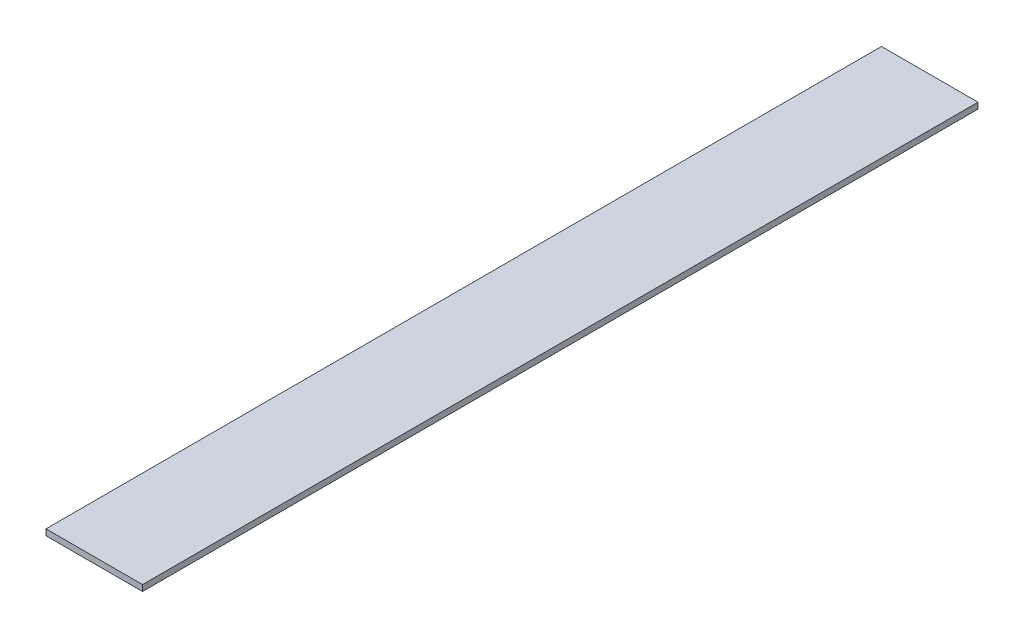
ISO-10303-21;
HEADER;
FILE_DESCRIPTION(('STEP AP214'),'2;1');
FILE_NAME('part.step','',(''),(''),'','','');
FILE_SCHEMA(('AUTOMOTIVE_DESIGN { 1 0 10303 214 1 1 1 1 }'));
ENDSEC;
DATA;
#1=APPLICATION_CONTEXT('core data for automotive mechanical design processes');
#2=APPLICATION_PROTOCOL_DEFINITION('international standard','automotive_design',2000,#1);
#3=PRODUCT_CONTEXT('',#1,'mechanical');
#4=PRODUCT('Part','Part','',(#3));
#5=PRODUCT_RELATED_PRODUCT_CATEGORY('part','',(#4));
#6=PRODUCT_DEFINITION_FORMATION('','',#4);
#7=PRODUCT_DEFINITION_CONTEXT('part definition',#1,'design');
#8=PRODUCT_DEFINITION('design','',#6,#7);
#9=PRODUCT_DEFINITION_SHAPE('','',#8);
#10=(LENGTH_UNIT() NAMED_UNIT(*) SI_UNIT(.MILLI.,.METRE.));
#11=(NAMED_UNIT(*) PLANE_ANGLE_UNIT() SI_UNIT($,.RADIAN.));
#12=(NAMED_UNIT(*) SI_UNIT($,.STERADIAN.) SOLID_ANGLE_UNIT());
#13=UNCERTAINTY_MEASURE_WITH_UNIT(LENGTH_MEASURE(1.E-05),#10,'distance_accuracy_value','');
#14=(GEOMETRIC_REPRESENTATION_CONTEXT(3) GLOBAL_UNCERTAINTY_ASSIGNED_CONTEXT((#13)) GLOBAL_UNIT_ASSIGNED_CONTEXT((#10,
#11,#12)) REPRESENTATION_CONTEXT('',''));
#15=CARTESIAN_POINT('',(0.,0.,0.));
#16=DIRECTION('',(0.,0.,1.));
#17=DIRECTION('',(1.,0.,0.));
#18=AXIS2_PLACEMENT_3D('',#15,#16,#17);
#19=CARTESIAN_POINT('',(25.4,3.175,-219.86875));
#20=DIRECTION('',(-1.,0.,0.));
#21=DIRECTION('',(0.,0.,1.));
#22=AXIS2_PLACEMENT_3D('',#19,#20,#21);
#23=PLANE('',#22);
#24=DIRECTION('',(0.,0.,-1.));
#25=VECTOR('',#24,1.);
#26=CARTESIAN_POINT('',(25.4,0.,-219.86875));
#27=LINE('',#26,#25);
#28=CARTESIAN_POINT('',(25.4,0.,219.86875));
#29=VERTEX_POINT('',#28);
#30=CARTESIAN_POINT('',(25.4,0.,-219.86875));
#31=VERTEX_POINT('',#30);
#32=EDGE_CURVE('E98',#29,#31,#27,.T.);
#33=ORIENTED_EDGE('',*,*,#32,.T.);
#34=DIRECTION('',(0.,-1.,0.));
#35=VECTOR('',#34,1.);
#36=CARTESIAN_POINT('',(25.4,3.175,-219.86875));
#37=LINE('',#36,#35);
#38=CARTESIAN_POINT('',(25.4,3.175,-219.86875));
#39=VERTEX_POINT('',#38);
#40=EDGE_CURVE('E11',#39,#31,#37,.T.);
#41=ORIENTED_EDGE('',*,*,#40,.F.);
#42=DIRECTION('',(0.,0.,-1.));
#43=VECTOR('',#42,1.);
#44=CARTESIAN_POINT('',(25.4,3.175,-219.86875));
#45=LINE('',#44,#43);
#46=CARTESIAN_POINT('',(25.4,3.175,219.86875));
#47=VERTEX_POINT('',#46);
#48=EDGE_CURVE('E86',#47,#39,#45,.T.);
#49=ORIENTED_EDGE('',*,*,#48,.F.);
#50=DIRECTION('',(0.,-1.,0.));
#51=VECTOR('',#50,1.);
#52=CARTESIAN_POINT('',(25.4,3.175,219.86875));
#53=LINE('',#52,#51);
#54=EDGE_CURVE('E94',#47,#29,#53,.T.);
#55=ORIENTED_EDGE('',*,*,#54,.T.);
#56=EDGE_LOOP('',(#33,#41,#49,#55));
#57=FACE_BOUND('',#56,.T.);
#58=ADVANCED_FACE('F35',(#57),#23,.F.);
#59=CARTESIAN_POINT('',(-25.4,3.175,-219.86875));
#60=DIRECTION('',(0.,0.,1.));
#61=DIRECTION('',(1.,0.,0.));
#62=AXIS2_PLACEMENT_3D('',#59,#60,#61);
#63=PLANE('',#62);
#64=DIRECTION('',(-1.,0.,0.));
#65=VECTOR('',#64,1.);
#66=CARTESIAN_POINT('',(-25.4,0.,-219.86875));
#67=LINE('',#66,#65);
#68=CARTESIAN_POINT('',(-25.4,0.,-219.86875));
#69=VERTEX_POINT('',#68);
#70=EDGE_CURVE('E90',#31,#69,#67,.T.);
#71=ORIENTED_EDGE('',*,*,#70,.T.);
#72=DIRECTION('',(0.,-1.,0.));
#73=VECTOR('',#72,1.);
#74=CARTESIAN_POINT('',(-25.4,3.175,-219.86875));
#75=LINE('',#74,#73);
#76=CARTESIAN_POINT('',(-25.4,3.175,-219.86875));
#77=VERTEX_POINT('',#76);
#78=EDGE_CURVE('E43',#77,#69,#75,.T.);
#79=ORIENTED_EDGE('',*,*,#78,.F.);
#80=DIRECTION('',(-1.,0.,0.));
#81=VECTOR('',#80,1.);
#82=CARTESIAN_POINT('',(-25.4,3.175,-219.86875));
#83=LINE('',#82,#81);
#84=EDGE_CURVE('E81',#39,#77,#83,.T.);
#85=ORIENTED_EDGE('',*,*,#84,.F.);
#86=ORIENTED_EDGE('',*,*,#40,.T.);
#87=EDGE_LOOP('',(#71,#79,#85,#86));
#88=FACE_BOUND('',#87,.T.);
#89=ADVANCED_FACE('F89',(#88),#63,.F.);
#90=CARTESIAN_POINT('',(-25.4,3.175,-219.86875));
#91=DIRECTION('',(1.,0.,0.));
#92=DIRECTION('',(0.,0.,-1.));
#93=AXIS2_PLACEMENT_3D('',#90,#91,#92);
#94=PLANE('',#93);
#95=DIRECTION('',(0.,0.,1.));
#96=VECTOR('',#95,1.);
#97=CARTESIAN_POINT('',(-25.4,0.,-219.86875));
#98=LINE('',#97,#96);
#99=CARTESIAN_POINT('',(-25.4,0.,219.86875));
#100=VERTEX_POINT('',#99);
#101=EDGE_CURVE('E68',#69,#100,#98,.T.);
#102=ORIENTED_EDGE('',*,*,#101,.T.);
#103=DIRECTION('',(0.,-1.,0.));
#104=VECTOR('',#103,1.);
#105=CARTESIAN_POINT('',(-25.4,3.175,219.86875));
#106=LINE('',#105,#104);
#107=CARTESIAN_POINT('',(-25.4,3.175,219.86875));
#108=VERTEX_POINT('',#107);
#109=EDGE_CURVE('E91',#108,#100,#106,.T.);
#110=ORIENTED_EDGE('',*,*,#109,.F.);
#111=DIRECTION('',(0.,0.,1.));
#112=VECTOR('',#111,1.);
#113=CARTESIAN_POINT('',(-25.4,3.175,-219.86875));
#114=LINE('',#113,#112);
#115=EDGE_CURVE('E84',#77,#108,#114,.T.);
#116=ORIENTED_EDGE('',*,*,#115,.F.);
#117=ORIENTED_EDGE('',*,*,#78,.T.);
#118=EDGE_LOOP('',(#102,#110,#116,#117));
#119=FACE_BOUND('',#118,.T.);
#120=ADVANCED_FACE('F92',(#119),#94,.F.);
#121=CARTESIAN_POINT('',(-25.4,3.175,219.86875));
#122=DIRECTION('',(0.,0.,-1.));
#123=DIRECTION('',(-1.,0.,0.));
#124=AXIS2_PLACEMENT_3D('',#121,#122,#123);
#125=PLANE('',#124);
#126=DIRECTION('',(1.,0.,0.));
#127=VECTOR('',#126,1.);
#128=CARTESIAN_POINT('',(-25.4,0.,219.86875));
#129=LINE('',#128,#127);
#130=EDGE_CURVE('E74',#100,#29,#129,.T.);
#131=ORIENTED_EDGE('',*,*,#130,.T.);
#132=ORIENTED_EDGE('',*,*,#54,.F.);
#133=DIRECTION('',(1.,0.,0.));
#134=VECTOR('',#133,1.);
#135=CARTESIAN_POINT('',(-25.4,3.175,219.86875));
#136=LINE('',#135,#134);
#137=EDGE_CURVE('E51',#108,#47,#136,.T.);
#138=ORIENTED_EDGE('',*,*,#137,.F.);
#139=ORIENTED_EDGE('',*,*,#109,.T.);
#140=EDGE_LOOP('',(#131,#132,#138,#139));
#141=FACE_BOUND('',#140,.T.);
#142=ADVANCED_FACE('F105',(#141),#125,.F.);
#143=CARTESIAN_POINT('',(0.,3.175,0.));
#144=DIRECTION('',(0.,1.,0.));
#145=DIRECTION('',(0.,0.,1.));
#146=AXIS2_PLACEMENT_3D('',#143,#144,#145);
#147=PLANE('',#146);
#148=ORIENTED_EDGE('',*,*,#48,.T.);
#149=ORIENTED_EDGE('',*,*,#84,.T.);
#150=ORIENTED_EDGE('',*,*,#115,.T.);
#151=ORIENTED_EDGE('',*,*,#137,.T.);
#152=EDGE_LOOP('',(#148,#149,#150,#151));
#153=FACE_BOUND('',#152,.T.);
#154=ADVANCED_FACE('F82',(#153),#147,.T.);
#155=CARTESIAN_POINT('',(0.,0.,0.));
#156=DIRECTION('',(0.,1.,0.));
#157=DIRECTION('',(0.,0.,1.));
#158=AXIS2_PLACEMENT_3D('',#155,#156,#157);
#159=PLANE('',#158);
#160=ORIENTED_EDGE('',*,*,#32,.F.);
#161=ORIENTED_EDGE('',*,*,#130,.F.);
#162=ORIENTED_EDGE('',*,*,#101,.F.);
#163=ORIENTED_EDGE('',*,*,#70,.F.);
#164=EDGE_LOOP('',(#160,#161,#162,#163));
#165=FACE_BOUND('',#164,.T.);
#166=ADVANCED_FACE('F108',(#165),#159,.F.);
#167=CLOSED_SHELL('',(#58,#89,#120,#142,#154,#166));
#168=MANIFOLD_SOLID_BREP('B2',#167);
#169=ADVANCED_BREP_SHAPE_REPRESENTATION('',(#18,#168),#14);
#170=SHAPE_DEFINITION_REPRESENTATION(#9,#169);
ENDSEC;
END-ISO-10303-21;
